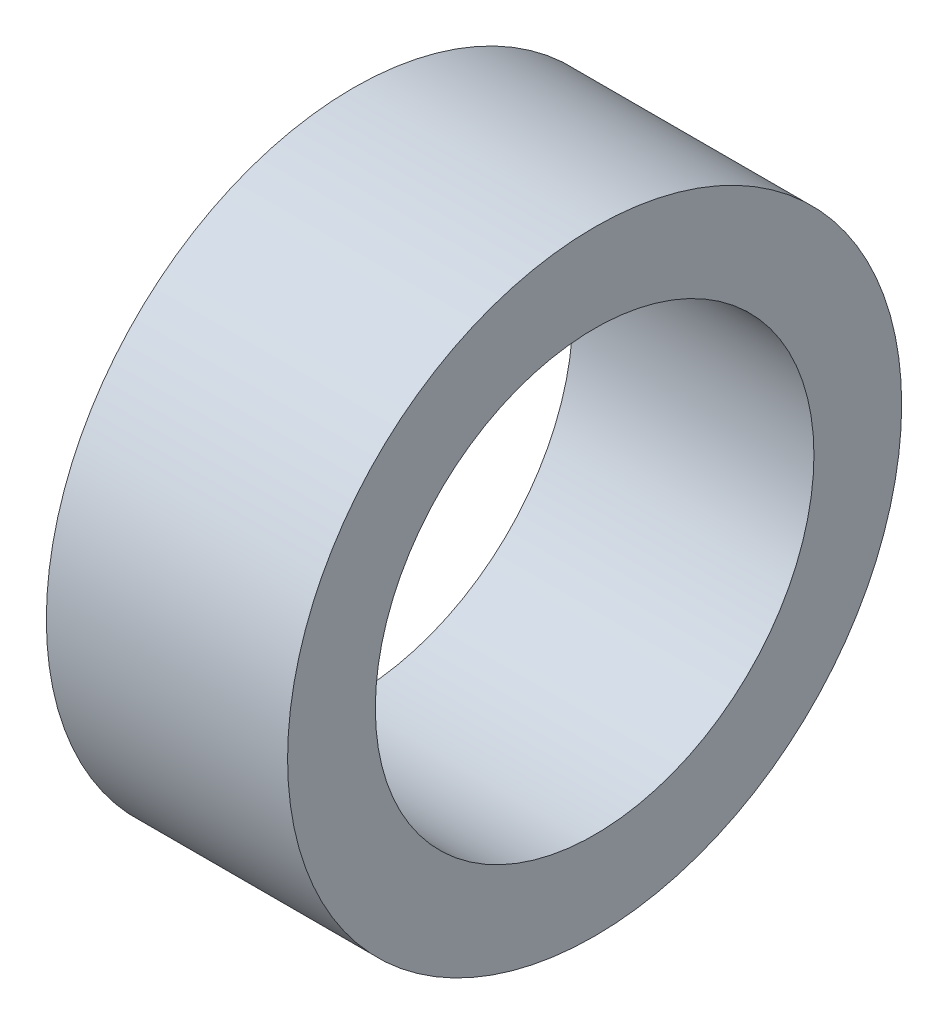
ISO-10303-21;
HEADER;
FILE_DESCRIPTION(('STEP AP214'),'2;1');
FILE_NAME('part.step','',(''),(''),'','','');
FILE_SCHEMA(('AUTOMOTIVE_DESIGN { 1 0 10303 214 1 1 1 1 }'));
ENDSEC;
DATA;
#1=APPLICATION_CONTEXT('core data for automotive mechanical design processes');
#2=APPLICATION_PROTOCOL_DEFINITION('international standard','automotive_design',2000,#1);
#3=PRODUCT_CONTEXT('',#1,'mechanical');
#4=PRODUCT('Part','Part','',(#3));
#5=PRODUCT_RELATED_PRODUCT_CATEGORY('part','',(#4));
#6=PRODUCT_DEFINITION_FORMATION('','',#4);
#7=PRODUCT_DEFINITION_CONTEXT('part definition',#1,'design');
#8=PRODUCT_DEFINITION('design','',#6,#7);
#9=PRODUCT_DEFINITION_SHAPE('','',#8);
#10=(LENGTH_UNIT() NAMED_UNIT(*) SI_UNIT(.MILLI.,.METRE.));
#11=(NAMED_UNIT(*) PLANE_ANGLE_UNIT() SI_UNIT($,.RADIAN.));
#12=(NAMED_UNIT(*) SI_UNIT($,.STERADIAN.) SOLID_ANGLE_UNIT());
#13=UNCERTAINTY_MEASURE_WITH_UNIT(LENGTH_MEASURE(1.E-05),#10,'distance_accuracy_value','');
#14=(GEOMETRIC_REPRESENTATION_CONTEXT(3) GLOBAL_UNCERTAINTY_ASSIGNED_CONTEXT((#13)) GLOBAL_UNIT_ASSIGNED_CONTEXT((#10,
#11,#12)) REPRESENTATION_CONTEXT('',''));
#15=CARTESIAN_POINT('',(0.,0.,0.));
#16=DIRECTION('',(0.,0.,1.));
#17=DIRECTION('',(1.,0.,0.));
#18=AXIS2_PLACEMENT_3D('',#15,#16,#17);
#19=CARTESIAN_POINT('',(21.,0.,0.));
#20=DIRECTION('',(1.,0.,0.));
#21=DIRECTION('',(0.,0.,-1.));
#22=AXIS2_PLACEMENT_3D('',#19,#20,#21);
#23=CYLINDRICAL_SURFACE('',#22,7.);
#24=CARTESIAN_POINT('',(21.,0.,0.));
#25=DIRECTION('',(1.,0.,0.));
#26=DIRECTION('',(0.,0.,-1.));
#27=AXIS2_PLACEMENT_3D('',#24,#25,#26);
#28=CIRCLE('',#27,7.);
#29=CARTESIAN_POINT('',(21.,0.,-7.));
#30=VERTEX_POINT('',#29);
#31=EDGE_CURVE('E10',#30,#30,#28,.T.);
#32=ORIENTED_EDGE('',*,*,#31,.T.);
#33=EDGE_LOOP('',(#32));
#34=FACE_BOUND('',#33,.T.);
#35=CARTESIAN_POINT('',(26.5,0.,0.));
#36=DIRECTION('',(1.,0.,0.));
#37=DIRECTION('',(0.,0.,-1.));
#38=AXIS2_PLACEMENT_3D('',#35,#36,#37);
#39=CIRCLE('',#38,7.);
#40=CARTESIAN_POINT('',(26.5,0.,-7.));
#41=VERTEX_POINT('',#40);
#42=EDGE_CURVE('E45',#41,#41,#39,.T.);
#43=ORIENTED_EDGE('',*,*,#42,.F.);
#44=EDGE_LOOP('',(#43));
#45=FACE_BOUND('',#44,.T.);
#46=ADVANCED_FACE('F31',(#34,#45),#23,.T.);
#47=CARTESIAN_POINT('',(21.,7.,0.));
#48=DIRECTION('',(-1.,0.,0.));
#49=DIRECTION('',(0.,0.,1.));
#50=AXIS2_PLACEMENT_3D('',#47,#48,#49);
#51=PLANE('',#50);
#52=CARTESIAN_POINT('',(21.,0.,0.));
#53=DIRECTION('',(1.,0.,0.));
#54=DIRECTION('',(0.,0.,-1.));
#55=AXIS2_PLACEMENT_3D('',#52,#53,#54);
#56=CIRCLE('',#55,5.);
#57=CARTESIAN_POINT('',(21.,0.,-5.));
#58=VERTEX_POINT('',#57);
#59=EDGE_CURVE('E37',#58,#58,#56,.T.);
#60=ORIENTED_EDGE('',*,*,#59,.T.);
#61=EDGE_LOOP('',(#60));
#62=FACE_BOUND('',#61,.T.);
#63=ORIENTED_EDGE('',*,*,#31,.F.);
#64=EDGE_LOOP('',(#63));
#65=FACE_BOUND('',#64,.T.);
#66=ADVANCED_FACE('F55',(#62,#65),#51,.T.);
#67=CARTESIAN_POINT('',(21.,0.,0.));
#68=DIRECTION('',(1.,0.,0.));
#69=DIRECTION('',(0.,0.,-1.));
#70=AXIS2_PLACEMENT_3D('',#67,#68,#69);
#71=CYLINDRICAL_SURFACE('',#70,5.);
#72=CARTESIAN_POINT('',(26.5,0.,0.));
#73=DIRECTION('',(1.,0.,0.));
#74=DIRECTION('',(0.,0.,-1.));
#75=AXIS2_PLACEMENT_3D('',#72,#73,#74);
#76=CIRCLE('',#75,5.);
#77=CARTESIAN_POINT('',(26.5,0.,-5.));
#78=VERTEX_POINT('',#77);
#79=EDGE_CURVE('E41',#78,#78,#76,.T.);
#80=ORIENTED_EDGE('',*,*,#79,.T.);
#81=EDGE_LOOP('',(#80));
#82=FACE_BOUND('',#81,.T.);
#83=ORIENTED_EDGE('',*,*,#59,.F.);
#84=EDGE_LOOP('',(#83));
#85=FACE_BOUND('',#84,.T.);
#86=ADVANCED_FACE('F59',(#82,#85),#71,.F.);
#87=CARTESIAN_POINT('',(26.5,5.,0.));
#88=DIRECTION('',(1.,0.,0.));
#89=DIRECTION('',(0.,0.,-1.));
#90=AXIS2_PLACEMENT_3D('',#87,#88,#89);
#91=PLANE('',#90);
#92=ORIENTED_EDGE('',*,*,#42,.T.);
#93=EDGE_LOOP('',(#92));
#94=FACE_BOUND('',#93,.T.);
#95=ORIENTED_EDGE('',*,*,#79,.F.);
#96=EDGE_LOOP('',(#95));
#97=FACE_BOUND('',#96,.T.);
#98=ADVANCED_FACE('F51',(#94,#97),#91,.T.);
#99=CLOSED_SHELL('',(#46,#66,#86,#98));
#100=MANIFOLD_SOLID_BREP('B2',#99);
#101=ADVANCED_BREP_SHAPE_REPRESENTATION('',(#18,#100),#14);
#102=SHAPE_DEFINITION_REPRESENTATION(#9,#101);
ENDSEC;
END-ISO-10303-21;
